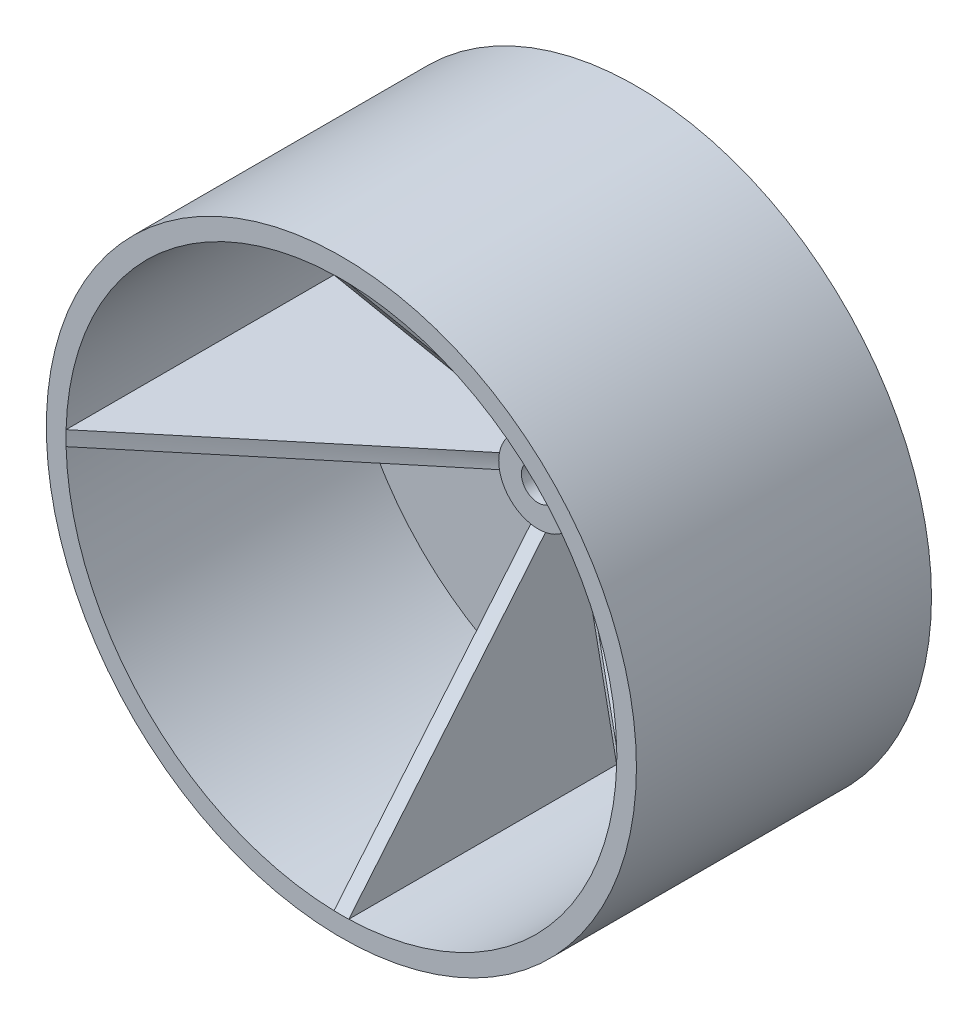
ISO-10303-21;
HEADER;
FILE_DESCRIPTION(('STEP AP214'),'2;1');
FILE_NAME('part.step','',(''),(''),'','','');
FILE_SCHEMA(('AUTOMOTIVE_DESIGN { 1 0 10303 214 1 1 1 1 }'));
ENDSEC;
DATA;
#1=APPLICATION_CONTEXT('core data for automotive mechanical design processes');
#2=APPLICATION_PROTOCOL_DEFINITION('international standard','automotive_design',2000,#1);
#3=PRODUCT_CONTEXT('',#1,'mechanical');
#4=PRODUCT('Part','Part','',(#3));
#5=PRODUCT_RELATED_PRODUCT_CATEGORY('part','',(#4));
#6=PRODUCT_DEFINITION_FORMATION('','',#4);
#7=PRODUCT_DEFINITION_CONTEXT('part definition',#1,'design');
#8=PRODUCT_DEFINITION('design','',#6,#7);
#9=PRODUCT_DEFINITION_SHAPE('','',#8);
#10=(LENGTH_UNIT() NAMED_UNIT(*) SI_UNIT(.MILLI.,.METRE.));
#11=(NAMED_UNIT(*) PLANE_ANGLE_UNIT() SI_UNIT($,.RADIAN.));
#12=(NAMED_UNIT(*) SI_UNIT($,.STERADIAN.) SOLID_ANGLE_UNIT());
#13=UNCERTAINTY_MEASURE_WITH_UNIT(LENGTH_MEASURE(1.E-05),#10,'distance_accuracy_value','');
#14=(GEOMETRIC_REPRESENTATION_CONTEXT(3) GLOBAL_UNCERTAINTY_ASSIGNED_CONTEXT((#13)) GLOBAL_UNIT_ASSIGNED_CONTEXT((#10,
#11,#12)) REPRESENTATION_CONTEXT('',''));
#15=CARTESIAN_POINT('',(0.,0.,0.));
#16=DIRECTION('',(0.,0.,1.));
#17=DIRECTION('',(1.,0.,0.));
#18=AXIS2_PLACEMENT_3D('',#15,#16,#17);
#19=CARTESIAN_POINT('',(0.,0.,0.));
#20=DIRECTION('',(0.,0.,1.));
#21=DIRECTION('',(1.,0.,0.));
#22=AXIS2_PLACEMENT_3D('',#19,#20,#21);
#23=PLANE('',#22);
#24=CARTESIAN_POINT('',(0.,0.,0.));
#25=DIRECTION('',(0.,0.,1.));
#26=DIRECTION('',(1.,0.,0.));
#27=AXIS2_PLACEMENT_3D('',#24,#25,#26);
#28=CIRCLE('',#27,28.);
#29=CARTESIAN_POINT('',(-0.75,27.9899535548025,0.));
#30=VERTEX_POINT('',#29);
#31=CARTESIAN_POINT('',(-27.9899535548025,0.749999999999902,0.));
#32=VERTEX_POINT('',#31);
#33=EDGE_CURVE('E330',#30,#32,#28,.T.);
#34=ORIENTED_EDGE('',*,*,#33,.T.);
#35=DIRECTION('',(-1.,0.,0.));
#36=VECTOR('',#35,1.);
#37=CARTESIAN_POINT('',(0.,0.75,0.));
#38=LINE('',#37,#36);
#39=CARTESIAN_POINT('',(-3.92905841137543,0.749999999999986,0.));
#40=VERTEX_POINT('',#39);
#41=EDGE_CURVE('E333',#40,#32,#38,.T.);
#42=ORIENTED_EDGE('',*,*,#41,.F.);
#43=CARTESIAN_POINT('',(0.,0.,0.));
#44=DIRECTION('',(0.,0.,1.));
#45=DIRECTION('',(1.,0.,0.));
#46=AXIS2_PLACEMENT_3D('',#43,#44,#45);
#47=CIRCLE('',#46,4.);
#48=CARTESIAN_POINT('',(-0.75,3.92905841137543,0.));
#49=VERTEX_POINT('',#48);
#50=EDGE_CURVE('E212',#49,#40,#47,.T.);
#51=ORIENTED_EDGE('',*,*,#50,.F.);
#52=DIRECTION('',(0.,1.,0.));
#53=VECTOR('',#52,1.);
#54=CARTESIAN_POINT('',(-0.75,0.,0.));
#55=LINE('',#54,#53);
#56=EDGE_CURVE('E334',#49,#30,#55,.T.);
#57=ORIENTED_EDGE('',*,*,#56,.T.);
#58=EDGE_LOOP('',(#34,#42,#51,#57));
#59=FACE_BOUND('',#58,.T.);
#60=ADVANCED_FACE('F49',(#59),#23,.T.);
#61=CARTESIAN_POINT('',(0.75,-27.9899535548025,0.));
#62=VERTEX_POINT('',#61);
#63=CARTESIAN_POINT('',(27.9899535548025,-0.749999999999707,0.));
#64=VERTEX_POINT('',#63);
#65=EDGE_CURVE('E201',#62,#64,#28,.T.);
#66=ORIENTED_EDGE('',*,*,#65,.T.);
#67=DIRECTION('',(1.,0.,0.));
#68=VECTOR('',#67,1.);
#69=CARTESIAN_POINT('',(0.,-0.75,0.));
#70=LINE('',#69,#68);
#71=CARTESIAN_POINT('',(3.92905841137544,-0.749999999999959,0.));
#72=VERTEX_POINT('',#71);
#73=EDGE_CURVE('E188',#72,#64,#70,.T.);
#74=ORIENTED_EDGE('',*,*,#73,.F.);
#75=CARTESIAN_POINT('',(0.75,-3.92905841137543,0.));
#76=VERTEX_POINT('',#75);
#77=EDGE_CURVE('E199',#76,#72,#47,.T.);
#78=ORIENTED_EDGE('',*,*,#77,.F.);
#79=DIRECTION('',(0.,-1.,0.));
#80=VECTOR('',#79,1.);
#81=CARTESIAN_POINT('',(0.75,0.,0.));
#82=LINE('',#81,#80);
#83=EDGE_CURVE('E514',#76,#62,#82,.T.);
#84=ORIENTED_EDGE('',*,*,#83,.T.);
#85=EDGE_LOOP('',(#66,#74,#78,#84));
#86=FACE_BOUND('',#85,.T.);
#87=ADVANCED_FACE('F197',(#86),#23,.T.);
#88=DIRECTION('',(-1.,0.,0.));
#89=VECTOR('',#88,1.);
#90=CARTESIAN_POINT('',(0.,-0.75,0.));
#91=LINE('',#90,#89);
#92=CARTESIAN_POINT('',(-3.92905841137543,-0.750000000000014,0.));
#93=VERTEX_POINT('',#92);
#94=CARTESIAN_POINT('',(-27.9899535548025,-0.750000000000098,0.));
#95=VERTEX_POINT('',#94);
#96=EDGE_CURVE('E350',#93,#95,#91,.T.);
#97=ORIENTED_EDGE('',*,*,#96,.T.);
#98=CARTESIAN_POINT('',(-0.75,-27.9899535548025,0.));
#99=VERTEX_POINT('',#98);
#100=EDGE_CURVE('E338',#95,#99,#28,.T.);
#101=ORIENTED_EDGE('',*,*,#100,.T.);
#102=DIRECTION('',(0.,-1.,0.));
#103=VECTOR('',#102,1.);
#104=CARTESIAN_POINT('',(-0.75,0.,0.));
#105=LINE('',#104,#103);
#106=CARTESIAN_POINT('',(-0.75,-3.92905841137543,0.));
#107=VERTEX_POINT('',#106);
#108=EDGE_CURVE('E80',#107,#99,#105,.T.);
#109=ORIENTED_EDGE('',*,*,#108,.F.);
#110=EDGE_CURVE('E207',#93,#107,#47,.T.);
#111=ORIENTED_EDGE('',*,*,#110,.F.);
#112=EDGE_LOOP('',(#97,#101,#109,#111));
#113=FACE_BOUND('',#112,.T.);
#114=ADVANCED_FACE('F313',(#113),#23,.T.);
#115=CARTESIAN_POINT('',(0.,0.,8.));
#116=DIRECTION('',(0.,0.,-1.));
#117=DIRECTION('',(-1.,0.,0.));
#118=AXIS2_PLACEMENT_3D('',#115,#116,#117);
#119=CYLINDRICAL_SURFACE('',#118,4.);
#120=DIRECTION('',(0.,0.,-1.));
#121=VECTOR('',#120,1.);
#122=CARTESIAN_POINT('',(-3.92905841137543,0.749999999999986,28.));
#123=LINE('',#122,#121);
#124=CARTESIAN_POINT('',(-3.92905841137543,0.749999999999986,8.));
#125=VERTEX_POINT('',#124);
#126=EDGE_CURVE('E348',#125,#40,#123,.T.);
#127=ORIENTED_EDGE('',*,*,#126,.F.);
#128=CARTESIAN_POINT('',(0.,0.,8.));
#129=DIRECTION('',(0.,0.,1.));
#130=DIRECTION('',(1.,0.,0.));
#131=AXIS2_PLACEMENT_3D('',#128,#129,#130);
#132=CIRCLE('',#131,4.);
#133=CARTESIAN_POINT('',(-0.75,3.92905841137543,8.));
#134=VERTEX_POINT('',#133);
#135=EDGE_CURVE('E419',#134,#125,#132,.T.);
#136=ORIENTED_EDGE('',*,*,#135,.F.);
#137=DIRECTION('',(0.,0.,-1.));
#138=VECTOR('',#137,1.);
#139=CARTESIAN_POINT('',(-0.75,3.92905841137543,28.));
#140=LINE('',#139,#138);
#141=EDGE_CURVE('E383',#134,#49,#140,.T.);
#142=ORIENTED_EDGE('',*,*,#141,.T.);
#143=ORIENTED_EDGE('',*,*,#50,.T.);
#144=EDGE_LOOP('',(#127,#136,#142,#143));
#145=FACE_BOUND('',#144,.T.);
#146=ADVANCED_FACE('F303',(#145),#119,.T.);
#147=DIRECTION('',(0.,0.,-1.));
#148=VECTOR('',#147,1.);
#149=CARTESIAN_POINT('',(3.92905841137544,-0.749999999999959,28.));
#150=LINE('',#149,#148);
#151=CARTESIAN_POINT('',(3.92905841137544,-0.749999999999959,8.));
#152=VERTEX_POINT('',#151);
#153=EDGE_CURVE('E184',#152,#72,#150,.T.);
#154=ORIENTED_EDGE('',*,*,#153,.F.);
#155=CARTESIAN_POINT('',(0.75,-3.92905841137543,8.));
#156=VERTEX_POINT('',#155);
#157=EDGE_CURVE('E417',#156,#152,#132,.T.);
#158=ORIENTED_EDGE('',*,*,#157,.F.);
#159=DIRECTION('',(0.,0.,-1.));
#160=VECTOR('',#159,1.);
#161=CARTESIAN_POINT('',(0.75,-3.92905841137543,28.));
#162=LINE('',#161,#160);
#163=EDGE_CURVE('E72',#156,#76,#162,.T.);
#164=ORIENTED_EDGE('',*,*,#163,.T.);
#165=ORIENTED_EDGE('',*,*,#77,.T.);
#166=EDGE_LOOP('',(#154,#158,#164,#165));
#167=FACE_BOUND('',#166,.T.);
#168=ADVANCED_FACE('F205',(#167),#119,.T.);
#169=CARTESIAN_POINT('',(-3.92905841137543,-0.750000000000014,8.));
#170=VERTEX_POINT('',#169);
#171=CARTESIAN_POINT('',(-0.75,-3.92905841137543,8.));
#172=VERTEX_POINT('',#171);
#173=EDGE_CURVE('E428',#170,#172,#132,.T.);
#174=ORIENTED_EDGE('',*,*,#173,.F.);
#175=DIRECTION('',(0.,0.,-1.));
#176=VECTOR('',#175,1.);
#177=CARTESIAN_POINT('',(-3.92905841137543,-0.750000000000014,28.));
#178=LINE('',#177,#176);
#179=EDGE_CURVE('E355',#170,#93,#178,.T.);
#180=ORIENTED_EDGE('',*,*,#179,.T.);
#181=ORIENTED_EDGE('',*,*,#110,.T.);
#182=DIRECTION('',(0.,0.,-1.));
#183=VECTOR('',#182,1.);
#184=CARTESIAN_POINT('',(-0.75,-3.92905841137543,28.));
#185=LINE('',#184,#183);
#186=EDGE_CURVE('E351',#172,#107,#185,.T.);
#187=ORIENTED_EDGE('',*,*,#186,.F.);
#188=EDGE_LOOP('',(#174,#180,#181,#187));
#189=FACE_BOUND('',#188,.T.);
#190=ADVANCED_FACE('F304',(#189),#119,.T.);
#191=CARTESIAN_POINT('',(0.,0.,28.));
#192=DIRECTION('',(0.,0.,-1.));
#193=DIRECTION('',(-1.,0.,0.));
#194=AXIS2_PLACEMENT_3D('',#191,#192,#193);
#195=CYLINDRICAL_SURFACE('',#194,28.);
#196=CARTESIAN_POINT('',(0.,0.,28.));
#197=DIRECTION('',(0.,0.,1.));
#198=DIRECTION('',(1.,0.,0.));
#199=AXIS2_PLACEMENT_3D('',#196,#197,#198);
#200=CIRCLE('',#199,28.);
#201=CARTESIAN_POINT('',(-0.75,27.9899535548025,28.));
#202=VERTEX_POINT('',#201);
#203=CARTESIAN_POINT('',(-27.9899535548025,0.749999999999902,28.));
#204=VERTEX_POINT('',#203);
#205=EDGE_CURVE('E373',#202,#204,#200,.T.);
#206=ORIENTED_EDGE('',*,*,#205,.T.);
#207=DIRECTION('',(0.,0.,-1.));
#208=VECTOR('',#207,1.);
#209=CARTESIAN_POINT('',(-27.9899535548025,0.749999999999902,28.));
#210=LINE('',#209,#208);
#211=EDGE_CURVE('E345',#204,#32,#210,.T.);
#212=ORIENTED_EDGE('',*,*,#211,.T.);
#213=ORIENTED_EDGE('',*,*,#33,.F.);
#214=DIRECTION('',(0.,0.,-1.));
#215=VECTOR('',#214,1.);
#216=CARTESIAN_POINT('',(-0.75,27.9899535548025,28.));
#217=LINE('',#216,#215);
#218=EDGE_CURVE('E392',#202,#30,#217,.T.);
#219=ORIENTED_EDGE('',*,*,#218,.F.);
#220=EDGE_LOOP('',(#206,#212,#213,#219));
#221=FACE_BOUND('',#220,.T.);
#222=ADVANCED_FACE('F642',(#221),#195,.F.);
#223=CARTESIAN_POINT('',(0.75,-27.9899535548025,28.));
#224=VERTEX_POINT('',#223);
#225=CARTESIAN_POINT('',(27.9899535548025,-0.749999999999707,28.));
#226=VERTEX_POINT('',#225);
#227=EDGE_CURVE('E493',#224,#226,#200,.T.);
#228=ORIENTED_EDGE('',*,*,#227,.T.);
#229=DIRECTION('',(0.,0.,-1.));
#230=VECTOR('',#229,1.);
#231=CARTESIAN_POINT('',(27.9899535548025,-0.749999999999707,28.));
#232=LINE('',#231,#230);
#233=EDGE_CURVE('E193',#226,#64,#232,.T.);
#234=ORIENTED_EDGE('',*,*,#233,.T.);
#235=ORIENTED_EDGE('',*,*,#65,.F.);
#236=DIRECTION('',(0.,0.,-1.));
#237=VECTOR('',#236,1.);
#238=CARTESIAN_POINT('',(0.75,-27.9899535548025,28.));
#239=LINE('',#238,#237);
#240=EDGE_CURVE('E519',#224,#62,#239,.T.);
#241=ORIENTED_EDGE('',*,*,#240,.F.);
#242=EDGE_LOOP('',(#228,#234,#235,#241));
#243=FACE_BOUND('',#242,.T.);
#244=ADVANCED_FACE('F525',(#243),#195,.F.);
#245=DIRECTION('',(0.,0.,-1.));
#246=VECTOR('',#245,1.);
#247=CARTESIAN_POINT('',(-27.9899535548025,-0.750000000000098,28.));
#248=LINE('',#247,#246);
#249=CARTESIAN_POINT('',(-27.9899535548025,-0.750000000000098,28.));
#250=VERTEX_POINT('',#249);
#251=EDGE_CURVE('E364',#250,#95,#248,.T.);
#252=ORIENTED_EDGE('',*,*,#251,.F.);
#253=CARTESIAN_POINT('',(-0.75,-27.9899535548025,28.));
#254=VERTEX_POINT('',#253);
#255=EDGE_CURVE('E378',#250,#254,#200,.T.);
#256=ORIENTED_EDGE('',*,*,#255,.T.);
#257=DIRECTION('',(0.,0.,-1.));
#258=VECTOR('',#257,1.);
#259=CARTESIAN_POINT('',(-0.75,-27.9899535548025,28.));
#260=LINE('',#259,#258);
#261=EDGE_CURVE('E358',#254,#99,#260,.T.);
#262=ORIENTED_EDGE('',*,*,#261,.T.);
#263=ORIENTED_EDGE('',*,*,#100,.F.);
#264=EDGE_LOOP('',(#252,#256,#262,#263));
#265=FACE_BOUND('',#264,.T.);
#266=ADVANCED_FACE('F311',(#265),#195,.F.);
#267=DIRECTION('',(1.,0.,0.));
#268=VECTOR('',#267,1.);
#269=CARTESIAN_POINT('',(0.,0.75,0.));
#270=LINE('',#269,#268);
#271=CARTESIAN_POINT('',(3.92905841137542,0.750000000000041,0.));
#272=VERTEX_POINT('',#271);
#273=CARTESIAN_POINT('',(27.9899535548025,0.750000000000293,0.));
#274=VERTEX_POINT('',#273);
#275=EDGE_CURVE('E203',#272,#274,#270,.T.);
#276=ORIENTED_EDGE('',*,*,#275,.T.);
#277=CARTESIAN_POINT('',(0.75,27.9899535548025,0.));
#278=VERTEX_POINT('',#277);
#279=EDGE_CURVE('E340',#274,#278,#28,.T.);
#280=ORIENTED_EDGE('',*,*,#279,.T.);
#281=DIRECTION('',(0.,1.,0.));
#282=VECTOR('',#281,1.);
#283=CARTESIAN_POINT('',(0.75,0.,0.));
#284=LINE('',#283,#282);
#285=CARTESIAN_POINT('',(0.75,3.92905841137543,0.));
#286=VERTEX_POINT('',#285);
#287=EDGE_CURVE('E372',#286,#278,#284,.T.);
#288=ORIENTED_EDGE('',*,*,#287,.F.);
#289=EDGE_CURVE('E208',#272,#286,#47,.T.);
#290=ORIENTED_EDGE('',*,*,#289,.F.);
#291=EDGE_LOOP('',(#276,#280,#288,#290));
#292=FACE_BOUND('',#291,.T.);
#293=ADVANCED_FACE('F301',(#292),#23,.T.);
#294=CARTESIAN_POINT('',(3.92905841137542,0.750000000000041,8.));
#295=VERTEX_POINT('',#294);
#296=CARTESIAN_POINT('',(0.75,3.92905841137543,8.));
#297=VERTEX_POINT('',#296);
#298=EDGE_CURVE('E407',#295,#297,#132,.T.);
#299=ORIENTED_EDGE('',*,*,#298,.F.);
#300=DIRECTION('',(0.,0.,-1.));
#301=VECTOR('',#300,1.);
#302=CARTESIAN_POINT('',(3.92905841137542,0.750000000000041,28.));
#303=LINE('',#302,#301);
#304=EDGE_CURVE('E449',#295,#272,#303,.T.);
#305=ORIENTED_EDGE('',*,*,#304,.T.);
#306=ORIENTED_EDGE('',*,*,#289,.T.);
#307=DIRECTION('',(0.,0.,-1.));
#308=VECTOR('',#307,1.);
#309=CARTESIAN_POINT('',(0.75,3.92905841137543,28.));
#310=LINE('',#309,#308);
#311=EDGE_CURVE('E213',#297,#286,#310,.T.);
#312=ORIENTED_EDGE('',*,*,#311,.F.);
#313=EDGE_LOOP('',(#299,#305,#306,#312));
#314=FACE_BOUND('',#313,.T.);
#315=ADVANCED_FACE('F297',(#314),#119,.T.);
#316=CARTESIAN_POINT('',(0.,0.,-2.));
#317=DIRECTION('',(0.,0.,1.));
#318=DIRECTION('',(1.,0.,0.));
#319=AXIS2_PLACEMENT_3D('',#316,#317,#318);
#320=CYLINDRICAL_SURFACE('',#319,1.7);
#321=DIRECTION('',(0.,0.,1.));
#322=VECTOR('',#321,1.);
#323=CARTESIAN_POINT('',(-1.25,1.15217186218029,-2.));
#324=LINE('',#323,#322);
#325=CARTESIAN_POINT('',(-1.25,1.15217186218029,-2.));
#326=VERTEX_POINT('',#325);
#327=CARTESIAN_POINT('',(-1.25,1.15217186218029,8.));
#328=VERTEX_POINT('',#327);
#329=EDGE_CURVE('E232',#326,#328,#324,.T.);
#330=ORIENTED_EDGE('',*,*,#329,.T.);
#331=CARTESIAN_POINT('',(0.,0.,8.));
#332=DIRECTION('',(0.,0.,1.));
#333=DIRECTION('',(1.,0.,0.));
#334=AXIS2_PLACEMENT_3D('',#331,#332,#333);
#335=CIRCLE('',#334,1.7);
#336=CARTESIAN_POINT('',(1.25,1.15217186218029,8.));
#337=VERTEX_POINT('',#336);
#338=EDGE_CURVE('E218',#328,#337,#335,.T.);
#339=ORIENTED_EDGE('',*,*,#338,.T.);
#340=DIRECTION('',(0.,0.,1.));
#341=VECTOR('',#340,1.);
#342=CARTESIAN_POINT('',(1.25,1.15217186218029,-2.));
#343=LINE('',#342,#341);
#344=CARTESIAN_POINT('',(1.25,1.15217186218029,-2.));
#345=VERTEX_POINT('',#344);
#346=EDGE_CURVE('E233',#345,#337,#343,.T.);
#347=ORIENTED_EDGE('',*,*,#346,.F.);
#348=CARTESIAN_POINT('',(0.,0.,-2.));
#349=DIRECTION('',(0.,0.,1.));
#350=DIRECTION('',(1.,0.,0.));
#351=AXIS2_PLACEMENT_3D('',#348,#349,#350);
#352=CIRCLE('',#351,1.7);
#353=EDGE_CURVE('E225',#326,#345,#352,.T.);
#354=ORIENTED_EDGE('',*,*,#353,.F.);
#355=EDGE_LOOP('',(#330,#339,#347,#354));
#356=FACE_BOUND('',#355,.T.);
#357=ADVANCED_FACE('F300',(#356),#320,.F.);
#358=CARTESIAN_POINT('',(0.,0.,-2.));
#359=DIRECTION('',(0.,0.,1.));
#360=DIRECTION('',(1.,0.,0.));
#361=AXIS2_PLACEMENT_3D('',#358,#359,#360);
#362=CYLINDRICAL_SURFACE('',#361,30.);
#363=CARTESIAN_POINT('',(0.,0.,28.));
#364=DIRECTION('',(0.,0.,1.));
#365=DIRECTION('',(1.,0.,0.));
#366=AXIS2_PLACEMENT_3D('',#363,#364,#365);
#367=CIRCLE('',#366,30.);
#368=CARTESIAN_POINT('',(30.,0.,28.));
#369=VERTEX_POINT('',#368);
#370=EDGE_CURVE('E377',#369,#369,#367,.T.);
#371=ORIENTED_EDGE('',*,*,#370,.F.);
#372=EDGE_LOOP('',(#371));
#373=FACE_BOUND('',#372,.T.);
#374=CARTESIAN_POINT('',(0.,0.,-2.));
#375=DIRECTION('',(0.,0.,1.));
#376=DIRECTION('',(1.,0.,0.));
#377=AXIS2_PLACEMENT_3D('',#374,#375,#376);
#378=CIRCLE('',#377,30.);
#379=CARTESIAN_POINT('',(30.,0.,-2.));
#380=VERTEX_POINT('',#379);
#381=EDGE_CURVE('E221',#380,#380,#378,.T.);
#382=ORIENTED_EDGE('',*,*,#381,.T.);
#383=EDGE_LOOP('',(#382));
#384=FACE_BOUND('',#383,.T.);
#385=ADVANCED_FACE('F265',(#373,#384),#362,.T.);
#386=CARTESIAN_POINT('',(0.,1.15217186218029,-2.));
#387=DIRECTION('',(0.,-1.,0.));
#388=DIRECTION('',(0.,0.,-1.));
#389=AXIS2_PLACEMENT_3D('',#386,#387,#388);
#390=PLANE('',#389);
#391=ORIENTED_EDGE('',*,*,#346,.T.);
#392=DIRECTION('',(1.,0.,0.));
#393=VECTOR('',#392,1.);
#394=CARTESIAN_POINT('',(0.,1.15217186218029,8.));
#395=LINE('',#394,#393);
#396=EDGE_CURVE('E404',#328,#337,#395,.T.);
#397=ORIENTED_EDGE('',*,*,#396,.F.);
#398=ORIENTED_EDGE('',*,*,#329,.F.);
#399=DIRECTION('',(1.,0.,0.));
#400=VECTOR('',#399,1.);
#401=CARTESIAN_POINT('',(0.,1.15217186218029,-2.));
#402=LINE('',#401,#400);
#403=EDGE_CURVE('E228',#326,#345,#402,.T.);
#404=ORIENTED_EDGE('',*,*,#403,.T.);
#405=EDGE_LOOP('',(#391,#397,#398,#404));
#406=FACE_BOUND('',#405,.T.);
#407=ADVANCED_FACE('F307',(#406),#390,.T.);
#408=CARTESIAN_POINT('',(0.,0.,-2.));
#409=DIRECTION('',(0.,0.,1.));
#410=DIRECTION('',(1.,0.,0.));
#411=AXIS2_PLACEMENT_3D('',#408,#409,#410);
#412=PLANE('',#411);
#413=ORIENTED_EDGE('',*,*,#381,.F.);
#414=EDGE_LOOP('',(#413));
#415=FACE_BOUND('',#414,.T.);
#416=ORIENTED_EDGE('',*,*,#353,.T.);
#417=ORIENTED_EDGE('',*,*,#403,.F.);
#418=EDGE_LOOP('',(#416,#417));
#419=FACE_BOUND('',#418,.T.);
#420=ADVANCED_FACE('F295',(#415,#419),#412,.F.);
#421=CARTESIAN_POINT('',(0.,0.,8.));
#422=DIRECTION('',(0.,0.,1.));
#423=DIRECTION('',(1.,0.,0.));
#424=AXIS2_PLACEMENT_3D('',#421,#422,#423);
#425=PLANE('',#424);
#426=ORIENTED_EDGE('',*,*,#338,.F.);
#427=ORIENTED_EDGE('',*,*,#396,.T.);
#428=EDGE_LOOP('',(#426,#427));
#429=FACE_BOUND('',#428,.T.);
#430=EDGE_CURVE('E219',#297,#134,#132,.T.);
#431=ORIENTED_EDGE('',*,*,#430,.T.);
#432=ORIENTED_EDGE('',*,*,#135,.T.);
#433=EDGE_CURVE('E423',#125,#170,#132,.T.);
#434=ORIENTED_EDGE('',*,*,#433,.T.);
#435=ORIENTED_EDGE('',*,*,#173,.T.);
#436=EDGE_CURVE('E432',#172,#156,#132,.T.);
#437=ORIENTED_EDGE('',*,*,#436,.T.);
#438=ORIENTED_EDGE('',*,*,#157,.T.);
#439=EDGE_CURVE('E411',#152,#295,#132,.T.);
#440=ORIENTED_EDGE('',*,*,#439,.T.);
#441=ORIENTED_EDGE('',*,*,#298,.T.);
#442=EDGE_LOOP('',(#431,#432,#434,#435,#437,#438,#440,#441));
#443=FACE_BOUND('',#442,.T.);
#444=ADVANCED_FACE('F291',(#429,#443),#425,.T.);
#445=CARTESIAN_POINT('',(0.75,0.,28.));
#446=DIRECTION('',(-1.,0.,0.));
#447=DIRECTION('',(0.,0.,1.));
#448=AXIS2_PLACEMENT_3D('',#445,#446,#447);
#449=PLANE('',#448);
#450=DIRECTION('',(0.,0.,-1.));
#451=VECTOR('',#450,1.);
#452=CARTESIAN_POINT('',(0.75,27.9899535548025,28.));
#453=LINE('',#452,#451);
#454=CARTESIAN_POINT('',(0.75,27.9899535548025,28.));
#455=VERTEX_POINT('',#454);
#456=EDGE_CURVE('E395',#455,#278,#453,.T.);
#457=ORIENTED_EDGE('',*,*,#456,.F.);
#458=CARTESIAN_POINT('',(0.75,27.9899535548026,28.));
#459=CARTESIAN_POINT('',(0.75,26.988306384059,27.1655962297844));
#460=CARTESIAN_POINT('',(0.75,25.9866459283525,26.3312084054174));
#461=CARTESIAN_POINT('',(0.75,23.9832801994662,24.6624870944522));
#462=CARTESIAN_POINT('',(0.75,22.9815749262983,23.82815360784));
#463=CARTESIAN_POINT('',(0.75,20.9781016837608,22.1595637254912));
#464=CARTESIAN_POINT('',(0.75,19.976333714448,21.3253073296866));
#465=CARTESIAN_POINT('',(0.75,17.9726980968474,19.6569137256179));
#466=CARTESIAN_POINT('',(0.75,16.9708304485344,18.8227765173843));
#467=CARTESIAN_POINT('',(0.75,14.9669309731104,17.1546957981185));
#468=CARTESIAN_POINT('',(0.75,13.9648991457199,16.3207522874222));
#469=CARTESIAN_POINT('',(0.75,12.4616211558447,15.0701145276143));
#470=CARTESIAN_POINT('',(0.75,11.9604903033246,14.6532816796517));
#471=CARTESIAN_POINT('',(0.75,10.958115489977,13.8197517323998));
#472=CARTESIAN_POINT('',(0.75,10.4568715291208,13.4030546331449));
#473=CARTESIAN_POINT('',(0.75,9.45421123764562,12.5698653867834));
#474=CARTESIAN_POINT('',(0.75,8.95279490661245,12.1533732401752));
#475=CARTESIAN_POINT('',(0.75,7.94968847691634,11.3207193581472));
#476=CARTESIAN_POINT('',(0.75,7.44799837844864,10.9045576224922));
#477=CARTESIAN_POINT('',(0.75,6.69509084993767,10.2807627789913));
#478=CARTESIAN_POINT('',(0.75,6.44405921247264,10.0729054623479));
#479=CARTESIAN_POINT('',(0.75,5.94181721517468,9.65740709577129));
#480=CARTESIAN_POINT('',(0.75,5.69060685542457,9.44976604573788));
#481=CARTESIAN_POINT('',(0.75,5.18793238424514,9.03478973089731));
#482=CARTESIAN_POINT('',(0.75,4.93646827214901,8.82745446689724));
#483=CARTESIAN_POINT('',(0.75,4.43311995555131,8.41329379188116));
#484=CARTESIAN_POINT('',(0.75,4.18123575035889,8.20646838170503));
#485=CARTESIAN_POINT('',(0.75,3.92905841137543,7.99999999999993));
#486=B_SPLINE_CURVE_WITH_KNOTS('',3,(#458,#459,#460,#461,#462,#463,#464,#465,#466,#467,#468,
#469,#470,#471,#472,#473,#474,#475,#476,#477,#478,#479,#480,#481,#482,#483,#484,#485),
.UNSPECIFIED.,.F.,.F.,(4,2,2,2,2,2,2,2,2,2,2,2,2,4),(0.,3.91097690731504,7.82195279274761,
11.7329251947346,15.6438985948645,19.554878726992,21.5103673451457,23.4658564580268,
25.4213503022579,27.3768427537388,28.3545920761956,29.3323409458273,30.3100923914858,
31.2878454467074),.UNSPECIFIED.);
#487=EDGE_CURVE('E270',#455,#297,#486,.T.);
#488=ORIENTED_EDGE('',*,*,#487,.T.);
#489=ORIENTED_EDGE('',*,*,#311,.T.);
#490=ORIENTED_EDGE('',*,*,#287,.T.);
#491=EDGE_LOOP('',(#457,#488,#489,#490));
#492=FACE_BOUND('',#491,.T.);
#493=ADVANCED_FACE('F286',(#492),#449,.F.);
#494=DIRECTION('',(0.,0.,-1.));
#495=VECTOR('',#494,1.);
#496=CARTESIAN_POINT('',(27.9899535548025,0.750000000000293,28.));
#497=LINE('',#496,#495);
#498=CARTESIAN_POINT('',(27.9899535548025,0.750000000000293,28.));
#499=VERTEX_POINT('',#498);
#500=EDGE_CURVE('E454',#499,#274,#497,.T.);
#501=ORIENTED_EDGE('',*,*,#500,.F.);
#502=EDGE_CURVE('E379',#499,#455,#200,.T.);
#503=ORIENTED_EDGE('',*,*,#502,.T.);
#504=ORIENTED_EDGE('',*,*,#456,.T.);
#505=ORIENTED_EDGE('',*,*,#279,.F.);
#506=EDGE_LOOP('',(#501,#503,#504,#505));
#507=FACE_BOUND('',#506,.T.);
#508=ADVANCED_FACE('F290',(#507),#195,.F.);
#509=CARTESIAN_POINT('',(-0.75,0.,28.));
#510=DIRECTION('',(-1.,0.,0.));
#511=DIRECTION('',(0.,0.,1.));
#512=AXIS2_PLACEMENT_3D('',#509,#510,#511);
#513=PLANE('',#512);
#514=ORIENTED_EDGE('',*,*,#141,.F.);
#515=CARTESIAN_POINT('',(-0.75,3.92905841137543,7.99999999999993));
#516=CARTESIAN_POINT('',(-0.75,4.07493186932746,8.11941183614026));
#517=CARTESIAN_POINT('',(-0.75,4.22069747367492,8.23895522933401));
#518=CARTESIAN_POINT('',(-0.75,4.51205861322843,8.47824889300357));
#519=CARTESIAN_POINT('',(-0.75,4.65765414856259,8.59799916332336));
#520=CARTESIAN_POINT('',(-0.75,5.09425385263845,8.95747572360808));
#521=CARTESIAN_POINT('',(-0.75,5.38507170546386,9.19742824335821));
#522=CARTESIAN_POINT('',(-0.75,5.96640382242492,9.67769899961337));
#523=CARTESIAN_POINT('',(-0.75,6.25691808734941,9.91801723516412));
#524=CARTESIAN_POINT('',(-0.75,6.83774575200135,10.3988966804134));
#525=CARTESIAN_POINT('',(-0.75,7.12805915159504,10.6394578902734));
#526=CARTESIAN_POINT('',(-0.75,7.9987905189607,11.3613830569836));
#527=CARTESIAN_POINT('',(-0.75,8.57900472171998,11.8429927418865));
#528=CARTESIAN_POINT('',(-0.75,9.73914521727804,12.8065587837297));
#529=CARTESIAN_POINT('',(-0.75,10.3190715100373,13.2885151407177));
#530=CARTESIAN_POINT('',(-0.75,12.0585963721948,14.7346896652771));
#531=CARTESIAN_POINT('',(-0.75,13.2179409588825,15.6992133141798));
#532=CARTESIAN_POINT('',(-0.75,15.5363471651951,17.6286084693274));
#533=CARTESIAN_POINT('',(-0.75,16.6954087838518,18.5934799767352));
#534=CARTESIAN_POINT('',(-0.75,19.0133728993397,20.5234139006136));
#535=CARTESIAN_POINT('',(-0.75,20.1722753961853,21.4884763170668));
#536=CARTESIAN_POINT('',(-0.75,22.4410035610334,23.3779161471026));
#537=CARTESIAN_POINT('',(-0.75,23.55083303634,24.3022889894804));
#538=CARTESIAN_POINT('',(-0.75,25.7704313809678,26.1511016601162));
#539=CARTESIAN_POINT('',(-0.75,26.8802002504368,27.0755414881967));
#540=CARTESIAN_POINT('',(-0.75,27.9899535548026,28.));
#541=B_SPLINE_CURVE_WITH_KNOTS('',3,(#515,#516,#517,#518,#519,#520,#521,#522,#523,#524,#525,
#526,#527,#528,#529,#530,#531,#532,#533,#534,#535,#536,#537,#538,#539,#540),.UNSPECIFIED.,.F.,
.F.,(4,2,2,2,2,2,2,2,2,2,2,2,4),(0.,0.565547503969288,1.1310945815974,2.26218646348111,
3.39327539899551,4.52436508701956,6.78652473770716,9.04868469904344,13.57300449145,
18.0973395521024,22.6216742003373,26.9547654215478,31.2878455535849),.UNSPECIFIED.);
#542=EDGE_CURVE('E236',#134,#202,#541,.T.);
#543=ORIENTED_EDGE('',*,*,#542,.T.);
#544=ORIENTED_EDGE('',*,*,#218,.T.);
#545=ORIENTED_EDGE('',*,*,#56,.F.);
#546=EDGE_LOOP('',(#514,#543,#544,#545));
#547=FACE_BOUND('',#546,.T.);
#548=ADVANCED_FACE('F249',(#547),#513,.T.);
#549=CARTESIAN_POINT('',(0.,0.,28.));
#550=DIRECTION('',(0.,0.,1.));
#551=DIRECTION('',(1.,0.,0.));
#552=AXIS2_PLACEMENT_3D('',#549,#550,#551);
#553=PLANE('',#552);
#554=ORIENTED_EDGE('',*,*,#502,.F.);
#555=CARTESIAN_POINT('',(0.,0.,28.));
#556=DIRECTION('',(0.,0.,1.));
#557=DIRECTION('',(1.,0.,0.));
#558=AXIS2_PLACEMENT_3D('',#555,#556,#557);
#559=CIRCLE('',#558,28.0000000000001);
#560=EDGE_CURVE('E65',#499,#226,#559,.F.);
#561=ORIENTED_EDGE('',*,*,#560,.T.);
#562=ORIENTED_EDGE('',*,*,#227,.F.);
#563=CARTESIAN_POINT('',(0.,0.,28.));
#564=DIRECTION('',(0.,0.,1.));
#565=DIRECTION('',(1.,0.,0.));
#566=AXIS2_PLACEMENT_3D('',#563,#564,#565);
#567=CIRCLE('',#566,28.0000000000001);
#568=EDGE_CURVE('E491',#224,#254,#567,.F.);
#569=ORIENTED_EDGE('',*,*,#568,.T.);
#570=ORIENTED_EDGE('',*,*,#255,.F.);
#571=CARTESIAN_POINT('',(0.,0.,28.));
#572=DIRECTION('',(0.,0.,1.));
#573=DIRECTION('',(1.,0.,0.));
#574=AXIS2_PLACEMENT_3D('',#571,#572,#573);
#575=CIRCLE('',#574,28.0000000000001);
#576=EDGE_CURVE('E484',#250,#204,#575,.F.);
#577=ORIENTED_EDGE('',*,*,#576,.T.);
#578=ORIENTED_EDGE('',*,*,#205,.F.);
#579=CARTESIAN_POINT('',(0.,0.,28.));
#580=DIRECTION('',(0.,0.,1.));
#581=DIRECTION('',(1.,0.,0.));
#582=AXIS2_PLACEMENT_3D('',#579,#580,#581);
#583=CIRCLE('',#582,28.0000000000001);
#584=EDGE_CURVE('E247',#202,#455,#583,.F.);
#585=ORIENTED_EDGE('',*,*,#584,.T.);
#586=EDGE_LOOP('',(#554,#561,#562,#569,#570,#577,#578,#585));
#587=FACE_BOUND('',#586,.T.);
#588=ORIENTED_EDGE('',*,*,#370,.T.);
#589=EDGE_LOOP('',(#588));
#590=FACE_BOUND('',#589,.T.);
#591=ADVANCED_FACE('F263',(#587,#590),#553,.T.);
#592=CARTESIAN_POINT('',(0.,0.,7.99999999999993));
#593=DIRECTION('',(0.,0.,1.));
#594=DIRECTION('',(1.,0.,0.));
#595=AXIS2_PLACEMENT_3D('',#592,#593,#594);
#596=CONICAL_SURFACE('',#595,4.,0.876058050598194);
#597=ORIENTED_EDGE('',*,*,#487,.F.);
#598=ORIENTED_EDGE('',*,*,#584,.F.);
#599=ORIENTED_EDGE('',*,*,#542,.F.);
#600=ORIENTED_EDGE('',*,*,#430,.F.);
#601=EDGE_LOOP('',(#597,#598,#599,#600));
#602=FACE_BOUND('',#601,.T.);
#603=ADVANCED_FACE('F254',(#602),#596,.F.);
#604=CARTESIAN_POINT('',(0.75,0.,28.));
#605=DIRECTION('',(1.,0.,0.));
#606=DIRECTION('',(0.,0.,-1.));
#607=AXIS2_PLACEMENT_3D('',#604,#605,#606);
#608=PLANE('',#607);
#609=ORIENTED_EDGE('',*,*,#163,.F.);
#610=CARTESIAN_POINT('',(0.75,-3.92905841137543,7.99999999999993));
#611=CARTESIAN_POINT('',(0.75,-4.07493186932746,8.11941183614026));
#612=CARTESIAN_POINT('',(0.75,-4.22069747367492,8.23895522933401));
#613=CARTESIAN_POINT('',(0.75,-4.51205861322843,8.47824889300357));
#614=CARTESIAN_POINT('',(0.75,-4.65765414856259,8.59799916332336));
#615=CARTESIAN_POINT('',(0.75,-5.09425385263845,8.95747572360808));
#616=CARTESIAN_POINT('',(0.75,-5.38507170546386,9.19742824335821));
#617=CARTESIAN_POINT('',(0.75,-5.96640382242492,9.67769899961337));
#618=CARTESIAN_POINT('',(0.75,-6.25691808734941,9.91801723516412));
#619=CARTESIAN_POINT('',(0.75,-6.83774575200135,10.3988966804134));
#620=CARTESIAN_POINT('',(0.75,-7.12805915159504,10.6394578902734));
#621=CARTESIAN_POINT('',(0.75,-7.9987905189607,11.3613830569836));
#622=CARTESIAN_POINT('',(0.75,-8.57900472171998,11.8429927418865));
#623=CARTESIAN_POINT('',(0.75,-9.73914521727804,12.8065587837297));
#624=CARTESIAN_POINT('',(0.75,-10.3190715100373,13.2885151407177));
#625=CARTESIAN_POINT('',(0.75,-12.0585963721948,14.7346896652771));
#626=CARTESIAN_POINT('',(0.75,-13.2179409588825,15.6992133141798));
#627=CARTESIAN_POINT('',(0.75,-15.5363471651951,17.6286084693274));
#628=CARTESIAN_POINT('',(0.75,-16.6954087838518,18.5934799767352));
#629=CARTESIAN_POINT('',(0.75,-19.0133728993397,20.5234139006136));
#630=CARTESIAN_POINT('',(0.75,-20.1722753961853,21.4884763170668));
#631=CARTESIAN_POINT('',(0.75,-22.4410035610334,23.3779161471026));
#632=CARTESIAN_POINT('',(0.75,-23.55083303634,24.3022889894804));
#633=CARTESIAN_POINT('',(0.75,-25.7704313809678,26.1511016601162));
#634=CARTESIAN_POINT('',(0.75,-26.8802002504368,27.0755414881967));
#635=CARTESIAN_POINT('',(0.75,-27.9899535548026,28.));
#636=B_SPLINE_CURVE_WITH_KNOTS('',3,(#610,#611,#612,#613,#614,#615,#616,#617,#618,#619,#620,
#621,#622,#623,#624,#625,#626,#627,#628,#629,#630,#631,#632,#633,#634,#635),.UNSPECIFIED.,.F.,
.F.,(4,2,2,2,2,2,2,2,2,2,2,2,4),(0.,0.565547503969288,1.1310945815974,2.26218646348111,
3.39327539899551,4.52436508701956,6.78652473770716,9.04868469904344,13.57300449145,
18.0973395521024,22.6216742003373,26.9547654215478,31.2878455535849),.UNSPECIFIED.);
#637=EDGE_CURVE('E524',#156,#224,#636,.T.);
#638=ORIENTED_EDGE('',*,*,#637,.T.);
#639=ORIENTED_EDGE('',*,*,#240,.T.);
#640=ORIENTED_EDGE('',*,*,#83,.F.);
#641=EDGE_LOOP('',(#609,#638,#639,#640));
#642=FACE_BOUND('',#641,.T.);
#643=ADVANCED_FACE('F262',(#642),#608,.T.);
#644=CARTESIAN_POINT('',(-0.75,0.,28.));
#645=DIRECTION('',(1.,0.,0.));
#646=DIRECTION('',(0.,0.,-1.));
#647=AXIS2_PLACEMENT_3D('',#644,#645,#646);
#648=PLANE('',#647);
#649=ORIENTED_EDGE('',*,*,#261,.F.);
#650=CARTESIAN_POINT('',(-0.75,-27.9899535548026,28.));
#651=CARTESIAN_POINT('',(-0.75,-26.988306384059,27.1655962297844));
#652=CARTESIAN_POINT('',(-0.75,-25.9866459283525,26.3312084054174));
#653=CARTESIAN_POINT('',(-0.75,-23.9832801994662,24.6624870944522));
#654=CARTESIAN_POINT('',(-0.75,-22.9815749262983,23.82815360784));
#655=CARTESIAN_POINT('',(-0.75,-20.9781016837608,22.1595637254912));
#656=CARTESIAN_POINT('',(-0.75,-19.976333714448,21.3253073296866));
#657=CARTESIAN_POINT('',(-0.75,-17.9726980968474,19.6569137256179));
#658=CARTESIAN_POINT('',(-0.75,-16.9708304485344,18.8227765173843));
#659=CARTESIAN_POINT('',(-0.75,-14.9669309731104,17.1546957981185));
#660=CARTESIAN_POINT('',(-0.75,-13.9648991457199,16.3207522874222));
#661=CARTESIAN_POINT('',(-0.75,-12.4616211558447,15.0701145276143));
#662=CARTESIAN_POINT('',(-0.75,-11.9604903033246,14.6532816796517));
#663=CARTESIAN_POINT('',(-0.75,-10.958115489977,13.8197517323998));
#664=CARTESIAN_POINT('',(-0.75,-10.4568715291208,13.4030546331449));
#665=CARTESIAN_POINT('',(-0.75,-9.45421123764562,12.5698653867834));
#666=CARTESIAN_POINT('',(-0.75,-8.95279490661245,12.1533732401752));
#667=CARTESIAN_POINT('',(-0.75,-7.94968847691634,11.3207193581472));
#668=CARTESIAN_POINT('',(-0.75,-7.44799837844864,10.9045576224922));
#669=CARTESIAN_POINT('',(-0.75,-6.69509084993767,10.2807627789913));
#670=CARTESIAN_POINT('',(-0.75,-6.44405921247264,10.0729054623479));
#671=CARTESIAN_POINT('',(-0.75,-5.94181721517468,9.65740709577129));
#672=CARTESIAN_POINT('',(-0.75,-5.69060685542457,9.44976604573788));
#673=CARTESIAN_POINT('',(-0.75,-5.18793238424514,9.03478973089731));
#674=CARTESIAN_POINT('',(-0.75,-4.93646827214901,8.82745446689724));
#675=CARTESIAN_POINT('',(-0.75,-4.43311995555131,8.41329379188116));
#676=CARTESIAN_POINT('',(-0.75,-4.18123575035889,8.20646838170503));
#677=CARTESIAN_POINT('',(-0.75,-3.92905841137543,7.99999999999993));
#678=B_SPLINE_CURVE_WITH_KNOTS('',3,(#650,#651,#652,#653,#654,#655,#656,#657,#658,#659,#660,
#661,#662,#663,#664,#665,#666,#667,#668,#669,#670,#671,#672,#673,#674,#675,#676,#677),
.UNSPECIFIED.,.F.,.F.,(4,2,2,2,2,2,2,2,2,2,2,2,2,4),(0.,3.91097690731504,7.82195279274761,
11.7329251947346,15.6438985948645,19.554878726992,21.5103673451457,23.4658564580268,
25.4213503022579,27.3768427537388,28.3545920761956,29.3323409458273,30.3100923914858,
31.2878454467074),.UNSPECIFIED.);
#679=EDGE_CURVE('E446',#254,#172,#678,.T.);
#680=ORIENTED_EDGE('',*,*,#679,.T.);
#681=ORIENTED_EDGE('',*,*,#186,.T.);
#682=ORIENTED_EDGE('',*,*,#108,.T.);
#683=EDGE_LOOP('',(#649,#680,#681,#682));
#684=FACE_BOUND('',#683,.T.);
#685=ADVANCED_FACE('F554',(#684),#648,.F.);
#686=CARTESIAN_POINT('',(0.,0.75,28.));
#687=DIRECTION('',(0.,1.,0.));
#688=DIRECTION('',(-1.,0.,0.));
#689=AXIS2_PLACEMENT_3D('',#686,#687,#688);
#690=PLANE('',#689);
#691=ORIENTED_EDGE('',*,*,#304,.F.);
#692=CARTESIAN_POINT('',(3.92905841137542,0.750000000000041,7.99999999999993));
#693=CARTESIAN_POINT('',(4.07493186932745,0.750000000000043,8.11941183614026));
#694=CARTESIAN_POINT('',(4.22069747367492,0.750000000000044,8.23895522933401));
#695=CARTESIAN_POINT('',(4.51205861322842,0.750000000000047,8.47824889300357));
#696=CARTESIAN_POINT('',(4.65765414856259,0.750000000000049,8.59799916332336));
#697=CARTESIAN_POINT('',(5.09425385263844,0.750000000000053,8.95747572360808));
#698=CARTESIAN_POINT('',(5.38507170546385,0.750000000000056,9.19742824335821));
#699=CARTESIAN_POINT('',(5.96640382242491,0.750000000000063,9.67769899961337));
#700=CARTESIAN_POINT('',(6.2569180873494,0.750000000000066,9.91801723516412));
#701=CARTESIAN_POINT('',(6.83774575200134,0.750000000000072,10.3988966804134));
#702=CARTESIAN_POINT('',(7.12805915159503,0.750000000000075,10.6394578902734));
#703=CARTESIAN_POINT('',(7.99879051896069,0.750000000000084,11.3613830569836));
#704=CARTESIAN_POINT('',(8.57900472171998,0.75000000000009,11.8429927418865));
#705=CARTESIAN_POINT('',(9.73914521727803,0.750000000000102,12.8065587837297));
#706=CARTESIAN_POINT('',(10.3190715100373,0.750000000000108,13.2885151407177));
#707=CARTESIAN_POINT('',(12.0585963721948,0.750000000000126,14.7346896652771));
#708=CARTESIAN_POINT('',(13.2179409588825,0.750000000000138,15.6992133141798));
#709=CARTESIAN_POINT('',(15.5363471651951,0.750000000000163,17.6286084693274));
#710=CARTESIAN_POINT('',(16.6954087838518,0.750000000000175,18.5934799767352));
#711=CARTESIAN_POINT('',(19.0133728993397,0.750000000000199,20.5234139006136));
#712=CARTESIAN_POINT('',(20.1722753961852,0.750000000000211,21.4884763170668));
#713=CARTESIAN_POINT('',(22.4410035610334,0.750000000000235,23.3779161471026));
#714=CARTESIAN_POINT('',(23.55083303634,0.750000000000247,24.3022889894804));
#715=CARTESIAN_POINT('',(25.7704313809678,0.75000000000027,26.1511016601162));
#716=CARTESIAN_POINT('',(26.8802002504368,0.750000000000281,27.0755414881967));
#717=CARTESIAN_POINT('',(27.9899535548026,0.750000000000293,28.));
#718=B_SPLINE_CURVE_WITH_KNOTS('',3,(#692,#693,#694,#695,#696,#697,#698,#699,#700,#701,#702,
#703,#704,#705,#706,#707,#708,#709,#710,#711,#712,#713,#714,#715,#716,#717),.UNSPECIFIED.,.F.,
.F.,(4,2,2,2,2,2,2,2,2,2,2,2,4),(0.,0.565547503969288,1.1310945815974,2.26218646348112,
3.39327539899552,4.52436508701956,6.78652473770716,9.04868469904345,13.57300449145,
18.0973395521024,22.6216742003373,26.9547654215478,31.2878455535849),.UNSPECIFIED.);
#719=EDGE_CURVE('E441',#295,#499,#718,.T.);
#720=ORIENTED_EDGE('',*,*,#719,.T.);
#721=ORIENTED_EDGE('',*,*,#500,.T.);
#722=ORIENTED_EDGE('',*,*,#275,.F.);
#723=EDGE_LOOP('',(#691,#720,#721,#722));
#724=FACE_BOUND('',#723,.T.);
#725=ADVANCED_FACE('F450',(#724),#690,.T.);
#726=CARTESIAN_POINT('',(0.,-0.75,28.));
#727=DIRECTION('',(0.,1.,0.));
#728=DIRECTION('',(-1.,0.,0.));
#729=AXIS2_PLACEMENT_3D('',#726,#727,#728);
#730=PLANE('',#729);
#731=ORIENTED_EDGE('',*,*,#233,.F.);
#732=CARTESIAN_POINT('',(27.9899535548026,-0.749999999999707,28.));
#733=CARTESIAN_POINT('',(26.988306384059,-0.749999999999717,27.1655962297844));
#734=CARTESIAN_POINT('',(25.9866459283525,-0.749999999999728,26.3312084054174));
#735=CARTESIAN_POINT('',(23.9832801994662,-0.749999999999749,24.6624870944522));
#736=CARTESIAN_POINT('',(22.9815749262983,-0.749999999999759,23.82815360784));
#737=CARTESIAN_POINT('',(20.9781016837608,-0.74999999999978,22.1595637254912));
#738=CARTESIAN_POINT('',(19.976333714448,-0.749999999999791,21.3253073296866));
#739=CARTESIAN_POINT('',(17.9726980968474,-0.749999999999812,19.6569137256179));
#740=CARTESIAN_POINT('',(16.9708304485344,-0.749999999999822,18.8227765173843));
#741=CARTESIAN_POINT('',(14.9669309731105,-0.749999999999843,17.1546957981185));
#742=CARTESIAN_POINT('',(13.9648991457199,-0.749999999999854,16.3207522874222));
#743=CARTESIAN_POINT('',(12.4616211558448,-0.749999999999869,15.0701145276143));
#744=CARTESIAN_POINT('',(11.9604903033247,-0.749999999999875,14.6532816796517));
#745=CARTESIAN_POINT('',(10.958115489977,-0.749999999999885,13.8197517323998));
#746=CARTESIAN_POINT('',(10.4568715291208,-0.74999999999989,13.4030546331449));
#747=CARTESIAN_POINT('',(9.45421123764563,-0.749999999999901,12.5698653867834));
#748=CARTESIAN_POINT('',(8.95279490661246,-0.749999999999906,12.1533732401752));
#749=CARTESIAN_POINT('',(7.94968847691634,-0.749999999999917,11.3207193581472));
#750=CARTESIAN_POINT('',(7.44799837844864,-0.749999999999922,10.9045576224922));
#751=CARTESIAN_POINT('',(6.69509084993768,-0.74999999999993,10.2807627789913));
#752=CARTESIAN_POINT('',(6.44405921247265,-0.749999999999933,10.0729054623479));
#753=CARTESIAN_POINT('',(5.94181721517469,-0.749999999999938,9.65740709577129));
#754=CARTESIAN_POINT('',(5.69060685542458,-0.74999999999994,9.44976604573788));
#755=CARTESIAN_POINT('',(5.18793238424515,-0.749999999999946,9.03478973089732));
#756=CARTESIAN_POINT('',(4.93646827214902,-0.749999999999948,8.82745446689724));
#757=CARTESIAN_POINT('',(4.43311995555132,-0.749999999999953,8.41329379188116));
#758=CARTESIAN_POINT('',(4.1812357503589,-0.749999999999956,8.20646838170503));
#759=CARTESIAN_POINT('',(3.92905841137543,-0.749999999999959,7.99999999999993));
#760=B_SPLINE_CURVE_WITH_KNOTS('',3,(#732,#733,#734,#735,#736,#737,#738,#739,#740,#741,#742,
#743,#744,#745,#746,#747,#748,#749,#750,#751,#752,#753,#754,#755,#756,#757,#758,#759),
.UNSPECIFIED.,.F.,.F.,(4,2,2,2,2,2,2,2,2,2,2,2,2,4),(0.,3.91097690731504,7.82195279274761,
11.7329251947346,15.6438985948645,19.554878726992,21.5103673451457,23.4658564580268,
25.4213503022579,27.3768427537388,28.3545920761956,29.3323409458273,30.3100923914858,
31.2878454467074),.UNSPECIFIED.);
#761=EDGE_CURVE('E11',#226,#152,#760,.T.);
#762=ORIENTED_EDGE('',*,*,#761,.T.);
#763=ORIENTED_EDGE('',*,*,#153,.T.);
#764=ORIENTED_EDGE('',*,*,#73,.T.);
#765=EDGE_LOOP('',(#731,#762,#763,#764));
#766=FACE_BOUND('',#765,.T.);
#767=ADVANCED_FACE('F187',(#766),#730,.F.);
#768=CARTESIAN_POINT('',(0.,0.75,28.));
#769=DIRECTION('',(0.,-1.,0.));
#770=DIRECTION('',(1.,0.,0.));
#771=AXIS2_PLACEMENT_3D('',#768,#769,#770);
#772=PLANE('',#771);
#773=ORIENTED_EDGE('',*,*,#211,.F.);
#774=CARTESIAN_POINT('',(-27.9899535548026,0.749999999999902,28.));
#775=CARTESIAN_POINT('',(-26.988306384059,0.749999999999906,27.1655962297844));
#776=CARTESIAN_POINT('',(-25.9866459283525,0.749999999999909,26.3312084054174));
#777=CARTESIAN_POINT('',(-23.9832801994662,0.749999999999916,24.6624870944522));
#778=CARTESIAN_POINT('',(-22.9815749262983,0.74999999999992,23.82815360784));
#779=CARTESIAN_POINT('',(-20.9781016837608,0.749999999999927,22.1595637254912));
#780=CARTESIAN_POINT('',(-19.976333714448,0.74999999999993,21.3253073296866));
#781=CARTESIAN_POINT('',(-17.9726980968474,0.749999999999937,19.6569137256179));
#782=CARTESIAN_POINT('',(-16.9708304485344,0.749999999999941,18.8227765173843));
#783=CARTESIAN_POINT('',(-14.9669309731104,0.749999999999948,17.1546957981185));
#784=CARTESIAN_POINT('',(-13.9648991457199,0.749999999999951,16.3207522874222));
#785=CARTESIAN_POINT('',(-12.4616211558448,0.749999999999957,15.0701145276143));
#786=CARTESIAN_POINT('',(-11.9604903033247,0.749999999999958,14.6532816796517));
#787=CARTESIAN_POINT('',(-10.958115489977,0.749999999999962,13.8197517323998));
#788=CARTESIAN_POINT('',(-10.4568715291208,0.749999999999963,13.4030546331449));
#789=CARTESIAN_POINT('',(-9.45421123764562,0.749999999999967,12.5698653867834));
#790=CARTESIAN_POINT('',(-8.95279490661245,0.749999999999969,12.1533732401752));
#791=CARTESIAN_POINT('',(-7.94968847691634,0.749999999999972,11.3207193581472));
#792=CARTESIAN_POINT('',(-7.44799837844864,0.749999999999974,10.9045576224922));
#793=CARTESIAN_POINT('',(-6.69509084993768,0.749999999999977,10.2807627789913));
#794=CARTESIAN_POINT('',(-6.44405921247265,0.749999999999978,10.0729054623479));
#795=CARTESIAN_POINT('',(-5.94181721517468,0.749999999999979,9.65740709577129));
#796=CARTESIAN_POINT('',(-5.69060685542458,0.74999999999998,9.44976604573788));
#797=CARTESIAN_POINT('',(-5.18793238424514,0.749999999999982,9.03478973089731));
#798=CARTESIAN_POINT('',(-4.93646827214901,0.749999999999983,8.82745446689724));
#799=CARTESIAN_POINT('',(-4.43311995555132,0.749999999999984,8.41329379188116));
#800=CARTESIAN_POINT('',(-4.18123575035889,0.749999999999985,8.20646838170503));
#801=CARTESIAN_POINT('',(-3.92905841137543,0.749999999999986,7.99999999999993));
#802=B_SPLINE_CURVE_WITH_KNOTS('',3,(#774,#775,#776,#777,#778,#779,#780,#781,#782,#783,#784,
#785,#786,#787,#788,#789,#790,#791,#792,#793,#794,#795,#796,#797,#798,#799,#800,#801),
.UNSPECIFIED.,.F.,.F.,(4,2,2,2,2,2,2,2,2,2,2,2,2,4),(0.,3.91097690731504,7.82195279274761,
11.7329251947346,15.6438985948645,19.554878726992,21.5103673451457,23.4658564580268,
25.4213503022579,27.3768427537388,28.3545920761956,29.3323409458273,30.3100923914858,
31.2878454467074),.UNSPECIFIED.);
#803=EDGE_CURVE('E534',#204,#125,#802,.T.);
#804=ORIENTED_EDGE('',*,*,#803,.T.);
#805=ORIENTED_EDGE('',*,*,#126,.T.);
#806=ORIENTED_EDGE('',*,*,#41,.T.);
#807=EDGE_LOOP('',(#773,#804,#805,#806));
#808=FACE_BOUND('',#807,.T.);
#809=ADVANCED_FACE('F344',(#808),#772,.F.);
#810=CARTESIAN_POINT('',(0.,-0.75,28.));
#811=DIRECTION('',(0.,-1.,0.));
#812=DIRECTION('',(1.,0.,0.));
#813=AXIS2_PLACEMENT_3D('',#810,#811,#812);
#814=PLANE('',#813);
#815=ORIENTED_EDGE('',*,*,#179,.F.);
#816=CARTESIAN_POINT('',(-3.92905841137543,-0.750000000000014,7.99999999999993));
#817=CARTESIAN_POINT('',(-4.07493186932746,-0.750000000000014,8.11941183614026));
#818=CARTESIAN_POINT('',(-4.22069747367492,-0.750000000000015,8.23895522933401));
#819=CARTESIAN_POINT('',(-4.51205861322842,-0.750000000000016,8.47824889300357));
#820=CARTESIAN_POINT('',(-4.65765414856259,-0.750000000000016,8.59799916332336));
#821=CARTESIAN_POINT('',(-5.09425385263844,-0.750000000000018,8.95747572360808));
#822=CARTESIAN_POINT('',(-5.38507170546386,-0.750000000000019,9.19742824335821));
#823=CARTESIAN_POINT('',(-5.96640382242492,-0.750000000000021,9.67769899961337));
#824=CARTESIAN_POINT('',(-6.25691808734941,-0.750000000000022,9.91801723516412));
#825=CARTESIAN_POINT('',(-6.83774575200135,-0.750000000000024,10.3988966804134));
#826=CARTESIAN_POINT('',(-7.12805915159504,-0.750000000000025,10.6394578902734));
#827=CARTESIAN_POINT('',(-7.9987905189607,-0.750000000000028,11.3613830569836));
#828=CARTESIAN_POINT('',(-8.57900472171998,-0.75000000000003,11.8429927418865));
#829=CARTESIAN_POINT('',(-9.73914521727804,-0.750000000000034,12.8065587837297));
#830=CARTESIAN_POINT('',(-10.3190715100373,-0.750000000000036,13.2885151407177));
#831=CARTESIAN_POINT('',(-12.0585963721948,-0.750000000000042,14.7346896652771));
#832=CARTESIAN_POINT('',(-13.2179409588825,-0.750000000000046,15.6992133141798));
#833=CARTESIAN_POINT('',(-15.5363471651951,-0.750000000000054,17.6286084693274));
#834=CARTESIAN_POINT('',(-16.6954087838518,-0.750000000000058,18.5934799767352));
#835=CARTESIAN_POINT('',(-19.0133728993397,-0.750000000000066,20.5234139006136));
#836=CARTESIAN_POINT('',(-20.1722753961853,-0.75000000000007,21.4884763170668));
#837=CARTESIAN_POINT('',(-22.4410035610334,-0.750000000000078,23.3779161471026));
#838=CARTESIAN_POINT('',(-23.55083303634,-0.750000000000082,24.3022889894804));
#839=CARTESIAN_POINT('',(-25.7704313809678,-0.75000000000009,26.1511016601162));
#840=CARTESIAN_POINT('',(-26.8802002504368,-0.750000000000094,27.0755414881967));
#841=CARTESIAN_POINT('',(-27.9899535548026,-0.750000000000098,28.));
#842=B_SPLINE_CURVE_WITH_KNOTS('',3,(#816,#817,#818,#819,#820,#821,#822,#823,#824,#825,#826,
#827,#828,#829,#830,#831,#832,#833,#834,#835,#836,#837,#838,#839,#840,#841),.UNSPECIFIED.,.F.,
.F.,(4,2,2,2,2,2,2,2,2,2,2,2,4),(0.,0.565547503969288,1.1310945815974,2.26218646348111,
3.39327539899551,4.52436508701956,6.78652473770717,9.04868469904345,13.57300449145,
18.0973395521024,22.6216742003373,26.9547654215478,31.2878455535849),.UNSPECIFIED.);
#843=EDGE_CURVE('E279',#170,#250,#842,.T.);
#844=ORIENTED_EDGE('',*,*,#843,.T.);
#845=ORIENTED_EDGE('',*,*,#251,.T.);
#846=ORIENTED_EDGE('',*,*,#96,.F.);
#847=EDGE_LOOP('',(#815,#844,#845,#846));
#848=FACE_BOUND('',#847,.T.);
#849=ADVANCED_FACE('F480',(#848),#814,.T.);
#850=CARTESIAN_POINT('',(0.,0.,7.99999999999993));
#851=DIRECTION('',(0.,0.,1.));
#852=DIRECTION('',(1.,0.,0.));
#853=AXIS2_PLACEMENT_3D('',#850,#851,#852);
#854=CONICAL_SURFACE('',#853,4.,0.876058050598194);
#855=ORIENTED_EDGE('',*,*,#803,.F.);
#856=ORIENTED_EDGE('',*,*,#576,.F.);
#857=ORIENTED_EDGE('',*,*,#843,.F.);
#858=ORIENTED_EDGE('',*,*,#433,.F.);
#859=EDGE_LOOP('',(#855,#856,#857,#858));
#860=FACE_BOUND('',#859,.T.);
#861=ADVANCED_FACE('F267',(#860),#854,.F.);
#862=CARTESIAN_POINT('',(0.,0.,7.99999999999993));
#863=DIRECTION('',(0.,0.,1.));
#864=DIRECTION('',(1.,0.,0.));
#865=AXIS2_PLACEMENT_3D('',#862,#863,#864);
#866=CONICAL_SURFACE('',#865,4.,0.876058050598194);
#867=ORIENTED_EDGE('',*,*,#679,.F.);
#868=ORIENTED_EDGE('',*,*,#568,.F.);
#869=ORIENTED_EDGE('',*,*,#637,.F.);
#870=ORIENTED_EDGE('',*,*,#436,.F.);
#871=EDGE_LOOP('',(#867,#868,#869,#870));
#872=FACE_BOUND('',#871,.T.);
#873=ADVANCED_FACE('F528',(#872),#866,.F.);
#874=CARTESIAN_POINT('',(0.,0.,7.99999999999993));
#875=DIRECTION('',(0.,0.,1.));
#876=DIRECTION('',(1.,0.,0.));
#877=AXIS2_PLACEMENT_3D('',#874,#875,#876);
#878=CONICAL_SURFACE('',#877,4.,0.876058050598194);
#879=ORIENTED_EDGE('',*,*,#761,.F.);
#880=ORIENTED_EDGE('',*,*,#560,.F.);
#881=ORIENTED_EDGE('',*,*,#719,.F.);
#882=ORIENTED_EDGE('',*,*,#439,.F.);
#883=EDGE_LOOP('',(#879,#880,#881,#882));
#884=FACE_BOUND('',#883,.T.);
#885=ADVANCED_FACE('F52',(#884),#878,.F.);
#886=CLOSED_SHELL('',(#60,#87,#114,#146,#168,#190,#222,#244,#266,#293,#315,#357,#385,#407,#420,
#444,#493,#508,#548,#591,#603,#643,#685,#725,#767,#809,#849,#861,#873,#885));
#887=MANIFOLD_SOLID_BREP('B2',#886);
#888=ADVANCED_BREP_SHAPE_REPRESENTATION('',(#18,#887),#14);
#889=SHAPE_DEFINITION_REPRESENTATION(#9,#888);
ENDSEC;
END-ISO-10303-21;
